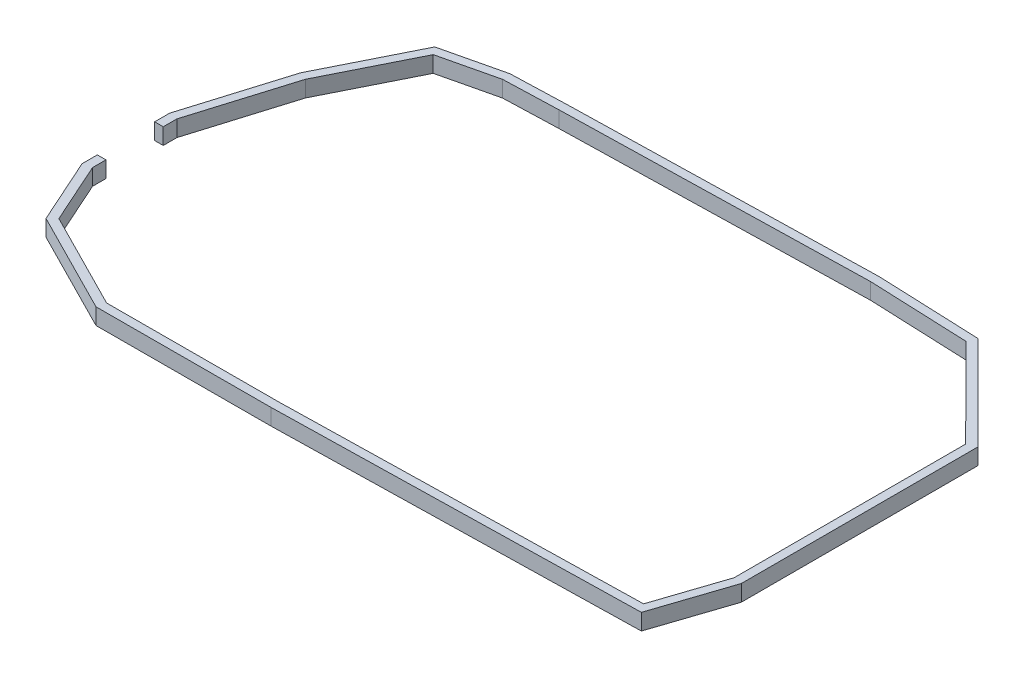
ISO-10303-21;
HEADER;
FILE_DESCRIPTION(('STEP AP214'),'2;1');
FILE_NAME('part.step','',(''),(''),'','','');
FILE_SCHEMA(('AUTOMOTIVE_DESIGN { 1 0 10303 214 1 1 1 1 }'));
ENDSEC;
DATA;
#1=APPLICATION_CONTEXT('core data for automotive mechanical design processes');
#2=APPLICATION_PROTOCOL_DEFINITION('international standard','automotive_design',2000,#1);
#3=PRODUCT_CONTEXT('',#1,'mechanical');
#4=PRODUCT('Part','Part','',(#3));
#5=PRODUCT_RELATED_PRODUCT_CATEGORY('part','',(#4));
#6=PRODUCT_DEFINITION_FORMATION('','',#4);
#7=PRODUCT_DEFINITION_CONTEXT('part definition',#1,'design');
#8=PRODUCT_DEFINITION('design','',#6,#7);
#9=PRODUCT_DEFINITION_SHAPE('','',#8);
#10=(LENGTH_UNIT() NAMED_UNIT(*) SI_UNIT(.MILLI.,.METRE.));
#11=(NAMED_UNIT(*) PLANE_ANGLE_UNIT() SI_UNIT($,.RADIAN.));
#12=(NAMED_UNIT(*) SI_UNIT($,.STERADIAN.) SOLID_ANGLE_UNIT());
#13=UNCERTAINTY_MEASURE_WITH_UNIT(LENGTH_MEASURE(1.E-05),#10,'distance_accuracy_value','');
#14=(GEOMETRIC_REPRESENTATION_CONTEXT(3) GLOBAL_UNCERTAINTY_ASSIGNED_CONTEXT((#13)) GLOBAL_UNIT_ASSIGNED_CONTEXT((#10,
#11,#12)) REPRESENTATION_CONTEXT('',''));
#15=CARTESIAN_POINT('',(0.,0.,0.));
#16=DIRECTION('',(0.,0.,1.));
#17=DIRECTION('',(1.,0.,0.));
#18=AXIS2_PLACEMENT_3D('',#15,#16,#17);
#19=CARTESIAN_POINT('',(-134.7633504157,99.55,-59.06712994019));
#20=DIRECTION('',(-0.894687808447042,0.,-0.446691980470021));
#21=DIRECTION('',(-0.446691980470021,0.,0.894687808447042));
#22=AXIS2_PLACEMENT_3D('',#19,#20,#21);
#23=PLANE('',#22);
#24=DIRECTION('',(0.,-1.,0.));
#25=VECTOR('',#24,1.);
#26=CARTESIAN_POINT('',(-134.7633504157,99.55,-59.06712994019));
#27=LINE('',#26,#25);
#28=CARTESIAN_POINT('',(-134.7633504157,99.55,-59.06712994019));
#29=VERTEX_POINT('',#28);
#30=CARTESIAN_POINT('',(-134.7633504157,94.45,-59.06712994019));
#31=VERTEX_POINT('',#30);
#32=EDGE_CURVE('E42',#29,#31,#27,.T.);
#33=ORIENTED_EDGE('',*,*,#32,.T.);
#34=DIRECTION('',(-0.446691980470021,0.,0.894687808447042));
#35=VECTOR('',#34,1.);
#36=CARTESIAN_POINT('',(-134.7633504157,94.45,-59.06712994019));
#37=LINE('',#36,#35);
#38=CARTESIAN_POINT('',(-148.8035804956,94.45,-30.94568780668));
#39=VERTEX_POINT('',#38);
#40=EDGE_CURVE('E343',#31,#39,#37,.T.);
#41=ORIENTED_EDGE('',*,*,#40,.T.);
#42=DIRECTION('',(0.,-1.,0.));
#43=VECTOR('',#42,1.);
#44=CARTESIAN_POINT('',(-148.8035804956,99.55,-30.94568780668));
#45=LINE('',#44,#43);
#46=CARTESIAN_POINT('',(-148.8035804956,99.55,-30.94568780668));
#47=VERTEX_POINT('',#46);
#48=EDGE_CURVE('E11',#47,#39,#45,.T.);
#49=ORIENTED_EDGE('',*,*,#48,.F.);
#50=DIRECTION('',(-0.446691980470021,0.,0.894687808447042));
#51=VECTOR('',#50,1.);
#52=CARTESIAN_POINT('',(-134.7633504157,99.55,-59.06712994019));
#53=LINE('',#52,#51);
#54=EDGE_CURVE('E468',#29,#47,#53,.T.);
#55=ORIENTED_EDGE('',*,*,#54,.F.);
#56=EDGE_LOOP('',(#33,#41,#49,#55));
#57=FACE_BOUND('',#56,.T.);
#58=ADVANCED_FACE('F17',(#57),#23,.T.);
#59=CARTESIAN_POINT('',(-148.8035804956,99.55,-30.94568780668));
#60=DIRECTION('',(-0.956779500675141,0.,-0.290814351585043));
#61=DIRECTION('',(-0.290814351585043,0.,0.956779500675141));
#62=AXIS2_PLACEMENT_3D('',#59,#60,#61);
#63=PLANE('',#62);
#64=ORIENTED_EDGE('',*,*,#48,.T.);
#65=DIRECTION('',(-0.290814351585043,0.,0.956779500675141));
#66=VECTOR('',#65,1.);
#67=CARTESIAN_POINT('',(-148.8035804956,94.45,-30.94568780668));
#68=LINE('',#67,#66);
#69=CARTESIAN_POINT('',(-158.4,94.45,0.626541732782));
#70=VERTEX_POINT('',#69);
#71=EDGE_CURVE('E339',#39,#70,#68,.T.);
#72=ORIENTED_EDGE('',*,*,#71,.T.);
#73=DIRECTION('',(0.,-1.,0.));
#74=VECTOR('',#73,1.);
#75=CARTESIAN_POINT('',(-158.4,99.55,0.626541732782));
#76=LINE('',#75,#74);
#77=CARTESIAN_POINT('',(-158.4,99.55,0.626541732782));
#78=VERTEX_POINT('',#77);
#79=EDGE_CURVE('E28',#78,#70,#76,.T.);
#80=ORIENTED_EDGE('',*,*,#79,.F.);
#81=DIRECTION('',(-0.290814351585043,0.,0.956779500675141));
#82=VECTOR('',#81,1.);
#83=CARTESIAN_POINT('',(-148.8035804956,99.55,-30.94568780668));
#84=LINE('',#83,#82);
#85=EDGE_CURVE('E21',#47,#78,#84,.T.);
#86=ORIENTED_EDGE('',*,*,#85,.F.);
#87=EDGE_LOOP('',(#64,#72,#80,#86));
#88=FACE_BOUND('',#87,.T.);
#89=ADVANCED_FACE('F679',(#88),#63,.T.);
#90=CARTESIAN_POINT('',(-158.4,99.55,0.626541732782));
#91=DIRECTION('',(-1.,0.,0.));
#92=DIRECTION('',(0.,0.,1.));
#93=AXIS2_PLACEMENT_3D('',#90,#91,#92);
#94=PLANE('',#93);
#95=DIRECTION('',(0.,0.,1.));
#96=VECTOR('',#95,1.);
#97=CARTESIAN_POINT('',(-158.4,99.55,0.626541732782));
#98=LINE('',#97,#96);
#99=CARTESIAN_POINT('',(-158.4,99.55,5.318774023319));
#100=VERTEX_POINT('',#99);
#101=EDGE_CURVE('E301',#78,#100,#98,.T.);
#102=ORIENTED_EDGE('',*,*,#101,.F.);
#103=ORIENTED_EDGE('',*,*,#79,.T.);
#104=DIRECTION('',(0.,0.,1.));
#105=VECTOR('',#104,1.);
#106=CARTESIAN_POINT('',(-158.4,94.45,0.626541732782));
#107=LINE('',#106,#105);
#108=CARTESIAN_POINT('',(-158.4,94.45,5.318774023319));
#109=VERTEX_POINT('',#108);
#110=EDGE_CURVE('E344',#70,#109,#107,.T.);
#111=ORIENTED_EDGE('',*,*,#110,.T.);
#112=DIRECTION('',(0.,-1.,0.));
#113=VECTOR('',#112,1.);
#114=CARTESIAN_POINT('',(-158.4,100.05,5.318774023319));
#115=LINE('',#114,#113);
#116=EDGE_CURVE('E512',#100,#109,#115,.T.);
#117=ORIENTED_EDGE('',*,*,#116,.F.);
#118=EDGE_LOOP('',(#102,#103,#111,#117));
#119=FACE_BOUND('',#118,.T.);
#120=ADVANCED_FACE('F611',(#119),#94,.T.);
#121=CARTESIAN_POINT('',(-150.7,100.55,5.318774023319));
#122=DIRECTION('',(0.,0.,-1.));
#123=DIRECTION('',(0.,-1.,0.));
#124=AXIS2_PLACEMENT_3D('',#121,#122,#123);
#125=PLANE('',#124);
#126=ORIENTED_EDGE('',*,*,#116,.T.);
#127=DIRECTION('',(-1.,0.,0.));
#128=VECTOR('',#127,1.);
#129=CARTESIAN_POINT('',(-98.3064200188,94.45,5.318774023319));
#130=LINE('',#129,#128);
#131=CARTESIAN_POINT('',(-155.7,94.45,5.318774023319));
#132=VERTEX_POINT('',#131);
#133=EDGE_CURVE('E429',#132,#109,#130,.T.);
#134=ORIENTED_EDGE('',*,*,#133,.F.);
#135=DIRECTION('',(0.,-1.,0.));
#136=VECTOR('',#135,1.);
#137=CARTESIAN_POINT('',(-155.7,100.55,5.318774023319));
#138=LINE('',#137,#136);
#139=CARTESIAN_POINT('',(-155.7,99.55,5.318774023319));
#140=VERTEX_POINT('',#139);
#141=EDGE_CURVE('E510',#140,#132,#138,.T.);
#142=ORIENTED_EDGE('',*,*,#141,.F.);
#143=DIRECTION('',(-1.,0.,0.));
#144=VECTOR('',#143,1.);
#145=CARTESIAN_POINT('',(-98.3064200188,99.55,5.318774023319));
#146=LINE('',#145,#144);
#147=EDGE_CURVE('E297',#140,#100,#146,.T.);
#148=ORIENTED_EDGE('',*,*,#147,.T.);
#149=EDGE_LOOP('',(#126,#134,#142,#148));
#150=FACE_BOUND('',#149,.T.);
#151=ADVANCED_FACE('F603',(#150),#125,.F.);
#152=CARTESIAN_POINT('',(-155.7,100.55,1.027812672614));
#153=DIRECTION('',(-1.,0.,0.));
#154=DIRECTION('',(0.,0.,1.));
#155=AXIS2_PLACEMENT_3D('',#152,#153,#154);
#156=PLANE('',#155);
#157=ORIENTED_EDGE('',*,*,#141,.T.);
#158=DIRECTION('',(0.,0.,1.));
#159=VECTOR('',#158,1.);
#160=CARTESIAN_POINT('',(-155.7,94.45,1.113861211773));
#161=LINE('',#160,#159);
#162=CARTESIAN_POINT('',(-155.7,94.45,1.027812672614));
#163=VERTEX_POINT('',#162);
#164=EDGE_CURVE('E279',#163,#132,#161,.T.);
#165=ORIENTED_EDGE('',*,*,#164,.F.);
#166=DIRECTION('',(0.,-1.,0.));
#167=VECTOR('',#166,1.);
#168=CARTESIAN_POINT('',(-155.7,100.55,1.027812672614));
#169=LINE('',#168,#167);
#170=CARTESIAN_POINT('',(-155.7,99.55,1.027812672614));
#171=VERTEX_POINT('',#170);
#172=EDGE_CURVE('E268',#171,#163,#169,.T.);
#173=ORIENTED_EDGE('',*,*,#172,.F.);
#174=DIRECTION('',(0.,0.,1.));
#175=VECTOR('',#174,1.);
#176=CARTESIAN_POINT('',(-155.7,99.55,1.113861211773));
#177=LINE('',#176,#175);
#178=EDGE_CURVE('E300',#171,#140,#177,.T.);
#179=ORIENTED_EDGE('',*,*,#178,.T.);
#180=EDGE_LOOP('',(#157,#165,#173,#179));
#181=FACE_BOUND('',#180,.T.);
#182=ADVANCED_FACE('F789',(#181),#156,.F.);
#183=CARTESIAN_POINT('',(-146.2863828275,100.55,-29.94299701645));
#184=DIRECTION('',(-0.956779500675141,0.,-0.290814351585043));
#185=DIRECTION('',(-0.290814351585043,0.,0.956779500675141));
#186=AXIS2_PLACEMENT_3D('',#183,#184,#185);
#187=PLANE('',#186);
#188=ORIENTED_EDGE('',*,*,#172,.T.);
#189=DIRECTION('',(-0.290814351585043,0.,0.956779500675141));
#190=VECTOR('',#189,1.);
#191=CARTESIAN_POINT('',(-146.3746199766,94.45,-29.65269670969));
#192=LINE('',#191,#190);
#193=CARTESIAN_POINT('',(-146.2863828275,94.45,-29.94299701645));
#194=VERTEX_POINT('',#193);
#195=EDGE_CURVE('E272',#194,#163,#192,.T.);
#196=ORIENTED_EDGE('',*,*,#195,.F.);
#197=DIRECTION('',(0.,-1.,0.));
#198=VECTOR('',#197,1.);
#199=CARTESIAN_POINT('',(-146.2863828275,100.55,-29.94299701645));
#200=LINE('',#199,#198);
#201=CARTESIAN_POINT('',(-146.2863828275,99.55,-29.94299701645));
#202=VERTEX_POINT('',#201);
#203=EDGE_CURVE('E256',#202,#194,#200,.T.);
#204=ORIENTED_EDGE('',*,*,#203,.F.);
#205=DIRECTION('',(-0.290814351585043,0.,0.956779500675141));
#206=VECTOR('',#205,1.);
#207=CARTESIAN_POINT('',(-146.3746199766,99.55,-29.65269670969));
#208=LINE('',#207,#206);
#209=EDGE_CURVE('E445',#202,#171,#208,.T.);
#210=ORIENTED_EDGE('',*,*,#209,.T.);
#211=EDGE_LOOP('',(#188,#196,#204,#210));
#212=FACE_BOUND('',#211,.T.);
#213=ADVANCED_FACE('F273',(#212),#187,.F.);
#214=CARTESIAN_POINT('',(-132.9124027547,100.55,-56.72999442121));
#215=DIRECTION('',(-0.894687808447042,0.,-0.446691980470021));
#216=DIRECTION('',(-0.446691980470021,0.,0.894687808447042));
#217=AXIS2_PLACEMENT_3D('',#214,#215,#216);
#218=PLANE('',#217);
#219=ORIENTED_EDGE('',*,*,#203,.T.);
#220=DIRECTION('',(-0.446691980470021,0.,0.894687808447042));
#221=VECTOR('',#220,1.);
#222=CARTESIAN_POINT('',(-135.8085686339,94.45,-50.92920905536));
#223=LINE('',#222,#221);
#224=CARTESIAN_POINT('',(-132.9124027547,94.45,-56.72999442121));
#225=VERTEX_POINT('',#224);
#226=EDGE_CURVE('E260',#225,#194,#223,.T.);
#227=ORIENTED_EDGE('',*,*,#226,.F.);
#228=DIRECTION('',(0.,-1.,0.));
#229=VECTOR('',#228,1.);
#230=CARTESIAN_POINT('',(-132.9124027547,100.55,-56.72999442121));
#231=LINE('',#230,#229);
#232=CARTESIAN_POINT('',(-132.9124027547,99.55,-56.72999442121));
#233=VERTEX_POINT('',#232);
#234=EDGE_CURVE('E269',#233,#225,#231,.T.);
#235=ORIENTED_EDGE('',*,*,#234,.F.);
#236=DIRECTION('',(-0.446691980470021,0.,0.894687808447042));
#237=VECTOR('',#236,1.);
#238=CARTESIAN_POINT('',(-135.8085686339,99.55,-50.92920905536));
#239=LINE('',#238,#237);
#240=EDGE_CURVE('E263',#233,#202,#239,.T.);
#241=ORIENTED_EDGE('',*,*,#240,.T.);
#242=EDGE_LOOP('',(#219,#227,#235,#241));
#243=FACE_BOUND('',#242,.T.);
#244=ADVANCED_FACE('F258',(#243),#218,.F.);
#245=CARTESIAN_POINT('',(-115.2720846066,100.55,-60.89614382919));
#246=DIRECTION('',(-0.229848822853935,0.,-0.973226345015722));
#247=DIRECTION('',(-0.973226345015722,0.,0.229848822853935));
#248=AXIS2_PLACEMENT_3D('',#245,#246,#247);
#249=PLANE('',#248);
#250=ORIENTED_EDGE('',*,*,#234,.T.);
#251=DIRECTION('',(-0.973226345015722,0.,0.229848822853935));
#252=VECTOR('',#251,1.);
#253=CARTESIAN_POINT('',(-89.36988963343,94.45,-67.01351729983));
#254=LINE('',#253,#252);
#255=CARTESIAN_POINT('',(-115.2720846066,94.45,-60.89614382919));
#256=VERTEX_POINT('',#255);
#257=EDGE_CURVE('E285',#256,#225,#254,.T.);
#258=ORIENTED_EDGE('',*,*,#257,.F.);
#259=DIRECTION('',(0.,-1.,0.));
#260=VECTOR('',#259,1.);
#261=CARTESIAN_POINT('',(-115.2720846066,100.55,-60.89614382919));
#262=LINE('',#261,#260);
#263=CARTESIAN_POINT('',(-115.2720846066,99.55,-60.89614382919));
#264=VERTEX_POINT('',#263);
#265=EDGE_CURVE('E438',#264,#256,#262,.T.);
#266=ORIENTED_EDGE('',*,*,#265,.F.);
#267=DIRECTION('',(-0.973226345015722,0.,0.229848822853935));
#268=VECTOR('',#267,1.);
#269=CARTESIAN_POINT('',(-89.36988963343,99.55,-67.01351729983));
#270=LINE('',#269,#268);
#271=EDGE_CURVE('E521',#264,#233,#270,.T.);
#272=ORIENTED_EDGE('',*,*,#271,.T.);
#273=EDGE_LOOP('',(#250,#258,#266,#272));
#274=FACE_BOUND('',#273,.T.);
#275=ADVANCED_FACE('F803',(#274),#249,.F.);
#276=CARTESIAN_POINT('',(-98.07765247511,100.55,-61.46791609549));
#277=DIRECTION('',(-0.0332349678904674,0.,-0.999447565862922));
#278=DIRECTION('',(-0.999447565862922,0.,0.0332349678904674));
#279=AXIS2_PLACEMENT_3D('',#276,#277,#278);
#280=PLANE('',#279);
#281=ORIENTED_EDGE('',*,*,#265,.T.);
#282=DIRECTION('',(-0.999447565862922,0.,0.0332349678904674));
#283=VECTOR('',#282,1.);
#284=CARTESIAN_POINT('',(-73.06486221473,94.45,-62.29967486859));
#285=LINE('',#284,#283);
#286=CARTESIAN_POINT('',(-98.07765247511,94.45,-61.46791609549));
#287=VERTEX_POINT('',#286);
#288=EDGE_CURVE('E292',#287,#256,#285,.T.);
#289=ORIENTED_EDGE('',*,*,#288,.F.);
#290=DIRECTION('',(0.,-1.,0.));
#291=VECTOR('',#290,1.);
#292=CARTESIAN_POINT('',(-98.07765247511,100.55,-61.46791609549));
#293=LINE('',#292,#291);
#294=CARTESIAN_POINT('',(-98.07765247511,99.55,-61.46791609549));
#295=VERTEX_POINT('',#294);
#296=EDGE_CURVE('E441',#295,#287,#293,.T.);
#297=ORIENTED_EDGE('',*,*,#296,.F.);
#298=DIRECTION('',(-0.999447565862922,0.,0.0332349678904674));
#299=VECTOR('',#298,1.);
#300=CARTESIAN_POINT('',(-73.06486221473,99.55,-62.29967486859));
#301=LINE('',#300,#299);
#302=EDGE_CURVE('E657',#295,#264,#301,.T.);
#303=ORIENTED_EDGE('',*,*,#302,.T.);
#304=EDGE_LOOP('',(#281,#289,#297,#303));
#305=FACE_BOUND('',#304,.T.);
#306=ADVANCED_FACE('F559',(#305),#280,.F.);
#307=CARTESIAN_POINT('',(-2.414992470044,100.55,-63.68571524558));
#308=DIRECTION('',(-0.0231773126798001,0.,-0.999731370007435));
#309=DIRECTION('',(-0.999731370007435,0.,0.0231773126798001));
#310=AXIS2_PLACEMENT_3D('',#307,#308,#309);
#311=PLANE('',#310);
#312=ORIENTED_EDGE('',*,*,#296,.T.);
#313=DIRECTION('',(-0.999731370007435,0.,0.0231773126798001));
#314=VECTOR('',#313,1.);
#315=CARTESIAN_POINT('',(-24.9039682134,94.45,-63.16434116621));
#316=LINE('',#315,#314);
#317=CARTESIAN_POINT('',(-2.414992470044,94.45,-63.68571524558));
#318=VERTEX_POINT('',#317);
#319=EDGE_CURVE('E337',#318,#287,#316,.T.);
#320=ORIENTED_EDGE('',*,*,#319,.F.);
#321=DIRECTION('',(0.,-1.,0.));
#322=VECTOR('',#321,1.);
#323=CARTESIAN_POINT('',(-2.414992470044,100.55,-63.68571524558));
#324=LINE('',#323,#322);
#325=CARTESIAN_POINT('',(-2.414992470044,99.55,-63.68571524558));
#326=VERTEX_POINT('',#325);
#327=EDGE_CURVE('E362',#326,#318,#324,.T.);
#328=ORIENTED_EDGE('',*,*,#327,.F.);
#329=DIRECTION('',(-0.999731370007435,0.,0.0231773126798001));
#330=VECTOR('',#329,1.);
#331=CARTESIAN_POINT('',(-24.9039682134,99.55,-63.16434116621));
#332=LINE('',#331,#330);
#333=EDGE_CURVE('E497',#326,#295,#332,.T.);
#334=ORIENTED_EDGE('',*,*,#333,.T.);
#335=EDGE_LOOP('',(#312,#320,#328,#334));
#336=FACE_BOUND('',#335,.T.);
#337=ADVANCED_FACE('F554',(#336),#311,.F.);
#338=CARTESIAN_POINT('',(28.752450026534,100.55,-62.41141158028));
#339=DIRECTION('',(0.040851600465121,0.,-0.999165224945023));
#340=DIRECTION('',(0.,-1.,0.));
#341=AXIS2_PLACEMENT_3D('',#338,#339,#340);
#342=PLANE('',#341);
#343=ORIENTED_EDGE('',*,*,#327,.T.);
#344=DIRECTION('',(-0.999165224945023,0.,-0.040851600465121));
#345=VECTOR('',#344,1.);
#346=CARTESIAN_POINT('',(-7.219664790476,94.45,-63.88215778491));
#347=LINE('',#346,#345);
#348=CARTESIAN_POINT('',(28.752450026534,94.45,-62.41141158028));
#349=VERTEX_POINT('',#348);
#350=EDGE_CURVE('E333',#349,#318,#347,.T.);
#351=ORIENTED_EDGE('',*,*,#350,.F.);
#352=DIRECTION('',(0.,-1.,0.));
#353=VECTOR('',#352,1.);
#354=CARTESIAN_POINT('',(28.752450026534,100.55,-62.41141158028));
#355=LINE('',#354,#353);
#356=CARTESIAN_POINT('',(28.752450026534,99.55,-62.41141158028));
#357=VERTEX_POINT('',#356);
#358=EDGE_CURVE('E358',#357,#349,#355,.T.);
#359=ORIENTED_EDGE('',*,*,#358,.F.);
#360=DIRECTION('',(-0.999165224945023,0.,-0.040851600465121));
#361=VECTOR('',#360,1.);
#362=CARTESIAN_POINT('',(-7.219664790476,99.55,-63.88215778491));
#363=LINE('',#362,#361);
#364=EDGE_CURVE('E492',#357,#326,#363,.T.);
#365=ORIENTED_EDGE('',*,*,#364,.T.);
#366=EDGE_LOOP('',(#343,#351,#359,#365));
#367=FACE_BOUND('',#366,.T.);
#368=ADVANCED_FACE('F564',(#367),#342,.F.);
#369=CARTESIAN_POINT('',(56.7,100.55,-34.42563537653));
#370=DIRECTION('',(0.707589870352046,0.,-0.706623361753046));
#371=DIRECTION('',(0.,-1.,0.));
#372=AXIS2_PLACEMENT_3D('',#369,#370,#371);
#373=PLANE('',#372);
#374=ORIENTED_EDGE('',*,*,#358,.T.);
#375=DIRECTION('',(-0.706623361753046,0.,-0.707589870352046));
#376=VECTOR('',#375,1.);
#377=CARTESIAN_POINT('',(39.988232023484,94.45,-51.16026145301));
#378=LINE('',#377,#376);
#379=CARTESIAN_POINT('',(56.7,94.45,-34.42563537653));
#380=VERTEX_POINT('',#379);
#381=EDGE_CURVE('E338',#380,#349,#378,.T.);
#382=ORIENTED_EDGE('',*,*,#381,.F.);
#383=DIRECTION('',(0.,-1.,0.));
#384=VECTOR('',#383,1.);
#385=CARTESIAN_POINT('',(56.7,100.55,-34.42563537653));
#386=LINE('',#385,#384);
#387=CARTESIAN_POINT('',(56.7,99.55,-34.42563537653));
#388=VERTEX_POINT('',#387);
#389=EDGE_CURVE('E357',#388,#380,#386,.T.);
#390=ORIENTED_EDGE('',*,*,#389,.F.);
#391=DIRECTION('',(-0.706623361753046,0.,-0.707589870352046));
#392=VECTOR('',#391,1.);
#393=CARTESIAN_POINT('',(39.988232023484,99.55,-51.16026145301));
#394=LINE('',#393,#392);
#395=EDGE_CURVE('E496',#388,#357,#394,.T.);
#396=ORIENTED_EDGE('',*,*,#395,.T.);
#397=EDGE_LOOP('',(#374,#382,#390,#396));
#398=FACE_BOUND('',#397,.T.);
#399=ADVANCED_FACE('F763',(#398),#373,.F.);
#400=CARTESIAN_POINT('',(56.7,100.55,38.328540100266));
#401=DIRECTION('',(1.,0.,0.));
#402=DIRECTION('',(0.,0.,1.));
#403=AXIS2_PLACEMENT_3D('',#400,#401,#402);
#404=PLANE('',#403);
#405=ORIENTED_EDGE('',*,*,#389,.T.);
#406=DIRECTION('',(0.,0.,-1.));
#407=VECTOR('',#406,1.);
#408=CARTESIAN_POINT('',(56.7,94.45,19.764224925599));
#409=LINE('',#408,#407);
#410=CARTESIAN_POINT('',(56.7,94.45,38.328540100266));
#411=VERTEX_POINT('',#410);
#412=EDGE_CURVE('E374',#411,#380,#409,.T.);
#413=ORIENTED_EDGE('',*,*,#412,.F.);
#414=DIRECTION('',(0.,-1.,0.));
#415=VECTOR('',#414,1.);
#416=CARTESIAN_POINT('',(56.7,100.55,38.328540100266));
#417=LINE('',#416,#415);
#418=CARTESIAN_POINT('',(56.7,99.55,38.328540100266));
#419=VERTEX_POINT('',#418);
#420=EDGE_CURVE('E353',#419,#411,#417,.T.);
#421=ORIENTED_EDGE('',*,*,#420,.F.);
#422=DIRECTION('',(0.,0.,-1.));
#423=VECTOR('',#422,1.);
#424=CARTESIAN_POINT('',(56.7,99.55,19.764224925599));
#425=LINE('',#424,#423);
#426=EDGE_CURVE('E529',#419,#388,#425,.T.);
#427=ORIENTED_EDGE('',*,*,#426,.T.);
#428=EDGE_LOOP('',(#405,#413,#421,#427));
#429=FACE_BOUND('',#428,.T.);
#430=ADVANCED_FACE('F761',(#429),#404,.F.);
#431=CARTESIAN_POINT('',(49.585312245764,100.55,59.672603362974));
#432=DIRECTION('',(0.948683298050514,0.,0.316227766016838));
#433=DIRECTION('',(0.,-1.,0.));
#434=AXIS2_PLACEMENT_3D('',#431,#432,#433);
#435=PLANE('',#434);
#436=ORIENTED_EDGE('',*,*,#420,.T.);
#437=DIRECTION('',(0.316227766016838,0.,-0.948683298050514));
#438=VECTOR('',#437,1.);
#439=CARTESIAN_POINT('',(53.581308673402,94.45,47.684614080061));
#440=LINE('',#439,#438);
#441=CARTESIAN_POINT('',(49.585312245764,94.45,59.672603362974));
#442=VERTEX_POINT('',#441);
#443=EDGE_CURVE('E413',#442,#411,#440,.T.);
#444=ORIENTED_EDGE('',*,*,#443,.F.);
#445=DIRECTION('',(0.,-1.,0.));
#446=VECTOR('',#445,1.);
#447=CARTESIAN_POINT('',(49.585312245764,100.55,59.672603362974));
#448=LINE('',#447,#446);
#449=CARTESIAN_POINT('',(49.585312245764,99.55,59.672603362974));
#450=VERTEX_POINT('',#449);
#451=EDGE_CURVE('E350',#450,#442,#448,.T.);
#452=ORIENTED_EDGE('',*,*,#451,.F.);
#453=DIRECTION('',(0.316227766016838,0.,-0.948683298050514));
#454=VECTOR('',#453,1.);
#455=CARTESIAN_POINT('',(53.581308673402,99.55,47.684614080061));
#456=LINE('',#455,#454);
#457=EDGE_CURVE('E525',#450,#419,#456,.T.);
#458=ORIENTED_EDGE('',*,*,#457,.T.);
#459=EDGE_LOOP('',(#436,#444,#452,#458));
#460=FACE_BOUND('',#459,.T.);
#461=ADVANCED_FACE('F757',(#460),#435,.F.);
#462=CARTESIAN_POINT('',(-62.50053338752,100.55,62.04399353344));
#463=DIRECTION('',(0.0211521767128717,0.,0.999776267682079));
#464=DIRECTION('',(0.,-1.,0.));
#465=AXIS2_PLACEMENT_3D('',#462,#463,#464);
#466=PLANE('',#465);
#467=ORIENTED_EDGE('',*,*,#451,.T.);
#468=DIRECTION('',(0.999776267682079,0.,-0.0211521767128717));
#469=VECTOR('',#468,1.);
#470=CARTESIAN_POINT('',(-53.56704906449,94.45,61.854988607868));
#471=LINE('',#470,#469);
#472=CARTESIAN_POINT('',(-62.50053338752,94.45,62.04399353344));
#473=VERTEX_POINT('',#472);
#474=EDGE_CURVE('E417',#473,#442,#471,.T.);
#475=ORIENTED_EDGE('',*,*,#474,.F.);
#476=DIRECTION('',(0.,-1.,0.));
#477=VECTOR('',#476,1.);
#478=CARTESIAN_POINT('',(-62.50053338752,100.55,62.04399353344));
#479=LINE('',#478,#477);
#480=CARTESIAN_POINT('',(-62.50053338752,99.55,62.04399353344));
#481=VERTEX_POINT('',#480);
#482=EDGE_CURVE('E354',#481,#473,#479,.T.);
#483=ORIENTED_EDGE('',*,*,#482,.F.);
#484=DIRECTION('',(0.999776267682079,0.,-0.0211521767128717));
#485=VECTOR('',#484,1.);
#486=CARTESIAN_POINT('',(-53.56704906449,99.55,61.854988607868));
#487=LINE('',#486,#485);
#488=EDGE_CURVE('E378',#481,#450,#487,.T.);
#489=ORIENTED_EDGE('',*,*,#488,.T.);
#490=EDGE_LOOP('',(#467,#475,#483,#489));
#491=FACE_BOUND('',#490,.T.);
#492=ADVANCED_FACE('F753',(#491),#466,.F.);
#493=CARTESIAN_POINT('',(-116.6391179552,100.55,62.167528114371));
#494=DIRECTION('',(0.00228181546145134,0.,0.999997396655711));
#495=DIRECTION('',(0.,-1.,0.));
#496=AXIS2_PLACEMENT_3D('',#493,#494,#495);
#497=PLANE('',#496);
#498=ORIENTED_EDGE('',*,*,#482,.T.);
#499=DIRECTION('',(0.999997396655711,0.,-0.00228181546145134));
#500=VECTOR('',#499,1.);
#501=CARTESIAN_POINT('',(-81.206604875,94.45,62.086677447704));
#502=LINE('',#501,#500);
#503=CARTESIAN_POINT('',(-116.6391179552,94.45,62.167528114371));
#504=VERTEX_POINT('',#503);
#505=EDGE_CURVE('E306',#504,#473,#502,.T.);
#506=ORIENTED_EDGE('',*,*,#505,.F.);
#507=DIRECTION('',(0.,-1.,0.));
#508=VECTOR('',#507,1.);
#509=CARTESIAN_POINT('',(-116.6391179552,100.55,62.167528114371));
#510=LINE('',#509,#508);
#511=CARTESIAN_POINT('',(-116.6391179552,99.55,62.167528114371));
#512=VERTEX_POINT('',#511);
#513=EDGE_CURVE('E463',#512,#504,#510,.T.);
#514=ORIENTED_EDGE('',*,*,#513,.F.);
#515=DIRECTION('',(0.999997396655711,0.,-0.00228181546145134));
#516=VECTOR('',#515,1.);
#517=CARTESIAN_POINT('',(-81.206604875,99.55,62.086677447704));
#518=LINE('',#517,#516);
#519=EDGE_CURVE('E366',#512,#481,#518,.T.);
#520=ORIENTED_EDGE('',*,*,#519,.T.);
#521=EDGE_LOOP('',(#498,#506,#514,#520));
#522=FACE_BOUND('',#521,.T.);
#523=ADVANCED_FACE('F749',(#522),#497,.F.);
#524=CARTESIAN_POINT('',(-147.0945652347,100.55,46.710701523703));
#525=DIRECTION('',(-0.452572007459911,0.,0.891727860988825));
#526=DIRECTION('',(0.,1.,0.));
#527=AXIS2_PLACEMENT_3D('',#524,#525,#526);
#528=PLANE('',#527);
#529=ORIENTED_EDGE('',*,*,#513,.T.);
#530=DIRECTION('',(0.891727860988825,0.,0.452572007459911));
#531=VECTOR('',#530,1.);
#532=CARTESIAN_POINT('',(-116.0492144747,94.45,62.466917439348));
#533=LINE('',#532,#531);
#534=CARTESIAN_POINT('',(-147.0945652347,94.45,46.710701523703));
#535=VERTEX_POINT('',#534);
#536=EDGE_CURVE('E302',#535,#504,#533,.T.);
#537=ORIENTED_EDGE('',*,*,#536,.F.);
#538=DIRECTION('',(0.,-1.,0.));
#539=VECTOR('',#538,1.);
#540=CARTESIAN_POINT('',(-147.0945652347,100.55,46.710701523703));
#541=LINE('',#540,#539);
#542=CARTESIAN_POINT('',(-147.0945652347,99.55,46.710701523703));
#543=VERTEX_POINT('',#542);
#544=EDGE_CURVE('E433',#543,#535,#541,.T.);
#545=ORIENTED_EDGE('',*,*,#544,.F.);
#546=DIRECTION('',(0.891727860988825,0.,0.452572007459911));
#547=VECTOR('',#546,1.);
#548=CARTESIAN_POINT('',(-116.0492144747,99.55,62.466917439348));
#549=LINE('',#548,#547);
#550=EDGE_CURVE('E319',#543,#512,#549,.T.);
#551=ORIENTED_EDGE('',*,*,#550,.T.);
#552=EDGE_LOOP('',(#529,#537,#545,#551));
#553=FACE_BOUND('',#552,.T.);
#554=ADVANCED_FACE('F745',(#553),#528,.F.);
#555=CARTESIAN_POINT('',(-155.7,100.55,27.544162381199));
#556=DIRECTION('',(-0.912268647108363,0.,0.409592377252163));
#557=DIRECTION('',(0.,1.,0.));
#558=AXIS2_PLACEMENT_3D('',#555,#556,#557);
#559=PLANE('',#558);
#560=ORIENTED_EDGE('',*,*,#544,.T.);
#561=DIRECTION('',(0.409592377252163,0.,0.912268647108363));
#562=VECTOR('',#561,1.);
#563=CARTESIAN_POINT('',(-151.4126024129,94.45,37.093310787241));
#564=LINE('',#563,#562);
#565=CARTESIAN_POINT('',(-155.7,94.45,27.544162381199));
#566=VERTEX_POINT('',#565);
#567=EDGE_CURVE('E307',#566,#535,#564,.T.);
#568=ORIENTED_EDGE('',*,*,#567,.F.);
#569=DIRECTION('',(0.,-1.,0.));
#570=VECTOR('',#569,1.);
#571=CARTESIAN_POINT('',(-155.7,100.55,27.544162381199));
#572=LINE('',#571,#570);
#573=CARTESIAN_POINT('',(-155.7,99.55,27.544162381199));
#574=VERTEX_POINT('',#573);
#575=EDGE_CURVE('E430',#574,#566,#572,.T.);
#576=ORIENTED_EDGE('',*,*,#575,.F.);
#577=DIRECTION('',(0.409592377252163,0.,0.912268647108363));
#578=VECTOR('',#577,1.);
#579=CARTESIAN_POINT('',(-151.4126024129,99.55,37.093310787241));
#580=LINE('',#579,#578);
#581=EDGE_CURVE('E314',#574,#543,#580,.T.);
#582=ORIENTED_EDGE('',*,*,#581,.T.);
#583=EDGE_LOOP('',(#560,#568,#576,#582));
#584=FACE_BOUND('',#583,.T.);
#585=ADVANCED_FACE('F741',(#584),#559,.F.);
#586=CARTESIAN_POINT('',(-155.7,100.55,1.027812672614));
#587=DIRECTION('',(-1.,0.,0.));
#588=DIRECTION('',(0.,0.,1.));
#589=AXIS2_PLACEMENT_3D('',#586,#587,#588);
#590=PLANE('',#589);
#591=ORIENTED_EDGE('',*,*,#575,.T.);
#592=DIRECTION('',(0.,0.,1.));
#593=VECTOR('',#592,1.);
#594=CARTESIAN_POINT('',(-155.7,94.45,1.113861211773));
#595=LINE('',#594,#593);
#596=CARTESIAN_POINT('',(-155.7,94.45,23.318774023319));
#597=VERTEX_POINT('',#596);
#598=EDGE_CURVE('E320',#597,#566,#595,.T.);
#599=ORIENTED_EDGE('',*,*,#598,.F.);
#600=DIRECTION('',(0.,1.,0.));
#601=VECTOR('',#600,1.);
#602=CARTESIAN_POINT('',(-155.7,100.55,23.318774023319));
#603=LINE('',#602,#601);
#604=CARTESIAN_POINT('',(-155.7,99.55,23.318774023319));
#605=VERTEX_POINT('',#604);
#606=EDGE_CURVE('E382',#597,#605,#603,.T.);
#607=ORIENTED_EDGE('',*,*,#606,.T.);
#608=DIRECTION('',(0.,0.,1.));
#609=VECTOR('',#608,1.);
#610=CARTESIAN_POINT('',(-155.7,99.55,1.113861211773));
#611=LINE('',#610,#609);
#612=EDGE_CURVE('E318',#605,#574,#611,.T.);
#613=ORIENTED_EDGE('',*,*,#612,.T.);
#614=EDGE_LOOP('',(#591,#599,#607,#613));
#615=FACE_BOUND('',#614,.T.);
#616=ADVANCED_FACE('F737',(#615),#590,.F.);
#617=CARTESIAN_POINT('',(-162.7,100.55,23.318774023319));
#618=DIRECTION('',(0.,0.,1.));
#619=DIRECTION('',(1.,0.,0.));
#620=AXIS2_PLACEMENT_3D('',#617,#618,#619);
#621=PLANE('',#620);
#622=ORIENTED_EDGE('',*,*,#606,.F.);
#623=DIRECTION('',(1.,0.,0.));
#624=VECTOR('',#623,1.);
#625=CARTESIAN_POINT('',(-104.3064200188,94.45,23.318774023319));
#626=LINE('',#625,#624);
#627=CARTESIAN_POINT('',(-158.4,94.45,23.318774023319));
#628=VERTEX_POINT('',#627);
#629=EDGE_CURVE('E324',#628,#597,#626,.T.);
#630=ORIENTED_EDGE('',*,*,#629,.F.);
#631=DIRECTION('',(0.,1.,0.));
#632=VECTOR('',#631,1.);
#633=CARTESIAN_POINT('',(-158.4,100.05,23.318774023319));
#634=LINE('',#633,#632);
#635=CARTESIAN_POINT('',(-158.4,99.55,23.318774023319));
#636=VERTEX_POINT('',#635);
#637=EDGE_CURVE('E379',#628,#636,#634,.T.);
#638=ORIENTED_EDGE('',*,*,#637,.T.);
#639=DIRECTION('',(1.,0.,0.));
#640=VECTOR('',#639,1.);
#641=CARTESIAN_POINT('',(-104.3064200188,99.55,23.318774023319));
#642=LINE('',#641,#640);
#643=EDGE_CURVE('E370',#636,#605,#642,.T.);
#644=ORIENTED_EDGE('',*,*,#643,.T.);
#645=EDGE_LOOP('',(#622,#630,#638,#644));
#646=FACE_BOUND('',#645,.T.);
#647=ADVANCED_FACE('F733',(#646),#621,.F.);
#648=CARTESIAN_POINT('',(-158.4,99.55,0.626541732782));
#649=DIRECTION('',(-1.,0.,0.));
#650=DIRECTION('',(0.,0.,1.));
#651=AXIS2_PLACEMENT_3D('',#648,#649,#650);
#652=PLANE('',#651);
#653=DIRECTION('',(0.,0.,1.));
#654=VECTOR('',#653,1.);
#655=CARTESIAN_POINT('',(-158.4,99.55,0.626541732782));
#656=LINE('',#655,#654);
#657=CARTESIAN_POINT('',(-158.4,99.55,28.122480401658));
#658=VERTEX_POINT('',#657);
#659=EDGE_CURVE('E643',#636,#658,#656,.T.);
#660=ORIENTED_EDGE('',*,*,#659,.F.);
#661=ORIENTED_EDGE('',*,*,#637,.F.);
#662=DIRECTION('',(0.,0.,1.));
#663=VECTOR('',#662,1.);
#664=CARTESIAN_POINT('',(-158.4,94.45,0.626541732782));
#665=LINE('',#664,#663);
#666=CARTESIAN_POINT('',(-158.4,94.45,28.122480401658));
#667=VERTEX_POINT('',#666);
#668=EDGE_CURVE('E328',#628,#667,#665,.T.);
#669=ORIENTED_EDGE('',*,*,#668,.T.);
#670=DIRECTION('',(0.,-1.,0.));
#671=VECTOR('',#670,1.);
#672=CARTESIAN_POINT('',(-158.4,99.55,28.122480401658));
#673=LINE('',#672,#671);
#674=EDGE_CURVE('E383',#658,#667,#673,.T.);
#675=ORIENTED_EDGE('',*,*,#674,.F.);
#676=EDGE_LOOP('',(#660,#661,#669,#675));
#677=FACE_BOUND('',#676,.T.);
#678=ADVANCED_FACE('F730',(#677),#652,.T.);
#679=CARTESIAN_POINT('',(-158.4,99.55,28.122480401658));
#680=DIRECTION('',(-0.912268647108363,0.,0.409592377252163));
#681=DIRECTION('',(0.,1.,0.));
#682=AXIS2_PLACEMENT_3D('',#679,#680,#681);
#683=PLANE('',#682);
#684=ORIENTED_EDGE('',*,*,#674,.T.);
#685=DIRECTION('',(0.409592377252163,0.,0.912268647108363));
#686=VECTOR('',#685,1.);
#687=CARTESIAN_POINT('',(-158.4,94.45,28.122480401658));
#688=LINE('',#687,#686);
#689=CARTESIAN_POINT('',(-149.1670271375,94.45,48.686709937644));
#690=VERTEX_POINT('',#689);
#691=EDGE_CURVE('E390',#667,#690,#688,.T.);
#692=ORIENTED_EDGE('',*,*,#691,.T.);
#693=DIRECTION('',(0.,-1.,0.));
#694=VECTOR('',#693,1.);
#695=CARTESIAN_POINT('',(-149.1670271375,99.55,48.686709937644));
#696=LINE('',#695,#694);
#697=CARTESIAN_POINT('',(-149.1670271375,99.55,48.686709937644));
#698=VERTEX_POINT('',#697);
#699=EDGE_CURVE('E434',#698,#690,#696,.T.);
#700=ORIENTED_EDGE('',*,*,#699,.F.);
#701=DIRECTION('',(0.409592377252163,0.,0.912268647108363));
#702=VECTOR('',#701,1.);
#703=CARTESIAN_POINT('',(-158.4,99.55,28.122480401658));
#704=LINE('',#703,#702);
#705=EDGE_CURVE('E425',#658,#698,#704,.T.);
#706=ORIENTED_EDGE('',*,*,#705,.F.);
#707=EDGE_LOOP('',(#684,#692,#700,#706));
#708=FACE_BOUND('',#707,.T.);
#709=ADVANCED_FACE('F19',(#708),#683,.T.);
#710=CARTESIAN_POINT('',(-149.1670271375,99.55,48.686709937644));
#711=DIRECTION('',(-0.452572007459911,0.,0.891727860988825));
#712=DIRECTION('',(0.,1.,0.));
#713=AXIS2_PLACEMENT_3D('',#710,#711,#712);
#714=PLANE('',#713);
#715=ORIENTED_EDGE('',*,*,#699,.T.);
#716=DIRECTION('',(0.891727860988825,0.,0.452572007459911));
#717=VECTOR('',#716,1.);
#718=CARTESIAN_POINT('',(-149.1670271375,94.45,48.686709937644));
#719=LINE('',#718,#717);
#720=CARTESIAN_POINT('',(-117.282153928,94.45,64.869002436664));
#721=VERTEX_POINT('',#720);
#722=EDGE_CURVE('E394',#690,#721,#719,.T.);
#723=ORIENTED_EDGE('',*,*,#722,.T.);
#724=DIRECTION('',(0.,-1.,0.));
#725=VECTOR('',#724,1.);
#726=CARTESIAN_POINT('',(-117.282153928,99.55,64.869002436664));
#727=LINE('',#726,#725);
#728=CARTESIAN_POINT('',(-117.282153928,99.55,64.869002436664));
#729=VERTEX_POINT('',#728);
#730=EDGE_CURVE('E437',#729,#721,#727,.T.);
#731=ORIENTED_EDGE('',*,*,#730,.F.);
#732=DIRECTION('',(0.891727860988825,0.,0.452572007459911));
#733=VECTOR('',#732,1.);
#734=CARTESIAN_POINT('',(-149.1670271375,99.55,48.686709937644));
#735=LINE('',#734,#733);
#736=EDGE_CURVE('E420',#698,#729,#735,.T.);
#737=ORIENTED_EDGE('',*,*,#736,.F.);
#738=EDGE_LOOP('',(#715,#723,#731,#737));
#739=FACE_BOUND('',#738,.T.);
#740=ADVANCED_FACE('F723',(#739),#714,.T.);
#741=CARTESIAN_POINT('',(-117.282153928,99.55,64.869002436664));
#742=DIRECTION('',(0.00228181546145134,0.,0.999997396655711));
#743=DIRECTION('',(0.,-1.,0.));
#744=AXIS2_PLACEMENT_3D('',#741,#742,#743);
#745=PLANE('',#744);
#746=ORIENTED_EDGE('',*,*,#730,.T.);
#747=DIRECTION('',(0.999997396655711,0.,-0.00228181546145134));
#748=VECTOR('',#747,1.);
#749=CARTESIAN_POINT('',(-117.282153928,94.45,64.869002436664));
#750=LINE('',#749,#748);
#751=CARTESIAN_POINT('',(-62.46889468114,94.45,64.743928368611));
#752=VERTEX_POINT('',#751);
#753=EDGE_CURVE('E451',#721,#752,#750,.T.);
#754=ORIENTED_EDGE('',*,*,#753,.T.);
#755=DIRECTION('',(0.,-1.,0.));
#756=VECTOR('',#755,1.);
#757=CARTESIAN_POINT('',(-62.46889468114,99.55,64.743928368611));
#758=LINE('',#757,#756);
#759=CARTESIAN_POINT('',(-62.46889468114,99.55,64.743928368611));
#760=VERTEX_POINT('',#759);
#761=EDGE_CURVE('E488',#760,#752,#758,.T.);
#762=ORIENTED_EDGE('',*,*,#761,.F.);
#763=DIRECTION('',(0.999997396655711,0.,-0.00228181546145134));
#764=VECTOR('',#763,1.);
#765=CARTESIAN_POINT('',(-117.282153928,99.55,64.869002436664));
#766=LINE('',#765,#764);
#767=EDGE_CURVE('E424',#729,#760,#766,.T.);
#768=ORIENTED_EDGE('',*,*,#767,.F.);
#769=EDGE_LOOP('',(#746,#754,#762,#768));
#770=FACE_BOUND('',#769,.T.);
#771=ADVANCED_FACE('F719',(#770),#745,.T.);
#772=CARTESIAN_POINT('',(-62.46889468114,99.55,64.743928368611));
#773=DIRECTION('',(0.0211521767128717,0.,0.999776267682079));
#774=DIRECTION('',(0.,-1.,0.));
#775=AXIS2_PLACEMENT_3D('',#772,#773,#774);
#776=PLANE('',#775);
#777=ORIENTED_EDGE('',*,*,#761,.T.);
#778=DIRECTION('',(0.999776267682079,0.,-0.0211521767128717));
#779=VECTOR('',#778,1.);
#780=CARTESIAN_POINT('',(-62.46889468114,94.45,64.743928368611));
#781=LINE('',#780,#779);
#782=CARTESIAN_POINT('',(51.544980913777,94.45,62.331747041388));
#783=VERTEX_POINT('',#782);
#784=EDGE_CURVE('E312',#752,#783,#781,.T.);
#785=ORIENTED_EDGE('',*,*,#784,.T.);
#786=DIRECTION('',(0.,-1.,0.));
#787=VECTOR('',#786,1.);
#788=CARTESIAN_POINT('',(51.544980913777,99.55,62.331747041388));
#789=LINE('',#788,#787);
#790=CARTESIAN_POINT('',(51.544980913777,99.55,62.331747041388));
#791=VERTEX_POINT('',#790);
#792=EDGE_CURVE('E516',#791,#783,#789,.T.);
#793=ORIENTED_EDGE('',*,*,#792,.F.);
#794=DIRECTION('',(0.999776267682079,0.,-0.0211521767128717));
#795=VECTOR('',#794,1.);
#796=CARTESIAN_POINT('',(-62.46889468114,99.55,64.743928368611));
#797=LINE('',#796,#795);
#798=EDGE_CURVE('E389',#760,#791,#797,.T.);
#799=ORIENTED_EDGE('',*,*,#798,.F.);
#800=EDGE_LOOP('',(#777,#785,#793,#799));
#801=FACE_BOUND('',#800,.T.);
#802=ADVANCED_FACE('F714',(#801),#776,.T.);
#803=CARTESIAN_POINT('',(51.544980913777,99.55,62.331747041388));
#804=DIRECTION('',(0.948683298050514,0.,0.316227766016838));
#805=DIRECTION('',(0.,-1.,0.));
#806=AXIS2_PLACEMENT_3D('',#803,#804,#805);
#807=PLANE('',#806);
#808=ORIENTED_EDGE('',*,*,#792,.T.);
#809=DIRECTION('',(0.316227766016838,0.,-0.948683298050514));
#810=VECTOR('',#809,1.);
#811=CARTESIAN_POINT('',(51.544980913777,94.45,62.331747041388));
#812=LINE('',#811,#810);
#813=CARTESIAN_POINT('',(59.4,94.45,38.76668978272));
#814=VERTEX_POINT('',#813);
#815=EDGE_CURVE('E308',#783,#814,#812,.T.);
#816=ORIENTED_EDGE('',*,*,#815,.T.);
#817=DIRECTION('',(0.,-1.,0.));
#818=VECTOR('',#817,1.);
#819=CARTESIAN_POINT('',(59.4,99.55,38.76668978272));
#820=LINE('',#819,#818);
#821=CARTESIAN_POINT('',(59.4,99.55,38.76668978272));
#822=VERTEX_POINT('',#821);
#823=EDGE_CURVE('E460',#822,#814,#820,.T.);
#824=ORIENTED_EDGE('',*,*,#823,.F.);
#825=DIRECTION('',(0.316227766016838,0.,-0.948683298050514));
#826=VECTOR('',#825,1.);
#827=CARTESIAN_POINT('',(51.544980913777,99.55,62.331747041388));
#828=LINE('',#827,#826);
#829=EDGE_CURVE('E384',#791,#822,#828,.T.);
#830=ORIENTED_EDGE('',*,*,#829,.F.);
#831=EDGE_LOOP('',(#808,#816,#824,#830));
#832=FACE_BOUND('',#831,.T.);
#833=ADVANCED_FACE('F711',(#832),#807,.T.);
#834=CARTESIAN_POINT('',(59.4,99.55,38.76668978272));
#835=DIRECTION('',(1.,0.,0.));
#836=DIRECTION('',(0.,0.,1.));
#837=AXIS2_PLACEMENT_3D('',#834,#835,#836);
#838=PLANE('',#837);
#839=ORIENTED_EDGE('',*,*,#823,.T.);
#840=DIRECTION('',(0.,0.,-1.));
#841=VECTOR('',#840,1.);
#842=CARTESIAN_POINT('',(59.4,94.45,38.76668978272));
#843=LINE('',#842,#841);
#844=CARTESIAN_POINT('',(59.4,94.45,-35.54293122717));
#845=VERTEX_POINT('',#844);
#846=EDGE_CURVE('E313',#814,#845,#843,.T.);
#847=ORIENTED_EDGE('',*,*,#846,.T.);
#848=DIRECTION('',(0.,-1.,0.));
#849=VECTOR('',#848,1.);
#850=CARTESIAN_POINT('',(59.4,99.55,-35.54293122717));
#851=LINE('',#850,#849);
#852=CARTESIAN_POINT('',(59.4,99.55,-35.54293122717));
#853=VERTEX_POINT('',#852);
#854=EDGE_CURVE('E329',#853,#845,#851,.T.);
#855=ORIENTED_EDGE('',*,*,#854,.F.);
#856=DIRECTION('',(0.,0.,-1.));
#857=VECTOR('',#856,1.);
#858=CARTESIAN_POINT('',(59.4,99.55,38.76668978272));
#859=LINE('',#858,#857);
#860=EDGE_CURVE('E388',#822,#853,#859,.T.);
#861=ORIENTED_EDGE('',*,*,#860,.F.);
#862=EDGE_LOOP('',(#839,#847,#855,#861));
#863=FACE_BOUND('',#862,.T.);
#864=ADVANCED_FACE('F707',(#863),#838,.T.);
#865=CARTESIAN_POINT('',(-115.6307758615,99.55,-63.58570854421));
#866=DIRECTION('',(-0.229848822853935,0.,-0.973226345015722));
#867=DIRECTION('',(-0.973226345015722,0.,0.229848822853935));
#868=AXIS2_PLACEMENT_3D('',#865,#866,#867);
#869=PLANE('',#868);
#870=DIRECTION('',(0.,-1.,0.));
#871=VECTOR('',#870,1.);
#872=CARTESIAN_POINT('',(-115.6307758615,99.55,-63.58570854421));
#873=LINE('',#872,#871);
#874=CARTESIAN_POINT('',(-115.6307758615,99.55,-63.58570854421));
#875=VERTEX_POINT('',#874);
#876=CARTESIAN_POINT('',(-115.6307758615,94.45,-63.58570854421));
#877=VERTEX_POINT('',#876);
#878=EDGE_CURVE('E406',#875,#877,#873,.T.);
#879=ORIENTED_EDGE('',*,*,#878,.T.);
#880=DIRECTION('',(-0.973226345015722,0.,0.229848822853935));
#881=VECTOR('',#880,1.);
#882=CARTESIAN_POINT('',(-115.6307758615,94.45,-63.58570854421));
#883=LINE('',#882,#881);
#884=EDGE_CURVE('E332',#877,#31,#883,.T.);
#885=ORIENTED_EDGE('',*,*,#884,.T.);
#886=ORIENTED_EDGE('',*,*,#32,.F.);
#887=DIRECTION('',(-0.973226345015722,0.,0.229848822853935));
#888=VECTOR('',#887,1.);
#889=CARTESIAN_POINT('',(-115.6307758615,99.55,-63.58570854421));
#890=LINE('',#889,#888);
#891=EDGE_CURVE('E464',#875,#29,#890,.T.);
#892=ORIENTED_EDGE('',*,*,#891,.F.);
#893=EDGE_LOOP('',(#879,#885,#886,#892));
#894=FACE_BOUND('',#893,.T.);
#895=ADVANCED_FACE('F686',(#894),#869,.T.);
#896=CARTESIAN_POINT('',(59.4,99.55,-35.54293122717));
#897=DIRECTION('',(0.707589870352046,0.,-0.706623361753046));
#898=DIRECTION('',(0.,-1.,0.));
#899=AXIS2_PLACEMENT_3D('',#896,#897,#898);
#900=PLANE('',#899);
#901=ORIENTED_EDGE('',*,*,#854,.T.);
#902=DIRECTION('',(-0.706623361753046,0.,-0.707589870352046));
#903=VECTOR('',#902,1.);
#904=CARTESIAN_POINT('',(59.4,94.45,-35.54293122717));
#905=LINE('',#904,#903);
#906=CARTESIAN_POINT('',(29.917212126023,94.45,-65.06604520628));
#907=VERTEX_POINT('',#906);
#908=EDGE_CURVE('E501',#845,#907,#905,.T.);
#909=ORIENTED_EDGE('',*,*,#908,.T.);
#910=DIRECTION('',(0.,-1.,0.));
#911=VECTOR('',#910,1.);
#912=CARTESIAN_POINT('',(29.917212126023,99.55,-65.06604520628));
#913=LINE('',#912,#911);
#914=CARTESIAN_POINT('',(29.917212126023,99.55,-65.06604520628));
#915=VERTEX_POINT('',#914);
#916=EDGE_CURVE('E412',#915,#907,#913,.T.);
#917=ORIENTED_EDGE('',*,*,#916,.F.);
#918=DIRECTION('',(-0.706623361753046,0.,-0.707589870352046));
#919=VECTOR('',#918,1.);
#920=CARTESIAN_POINT('',(59.4,99.55,-35.54293122717));
#921=LINE('',#920,#919);
#922=EDGE_CURVE('E507',#853,#915,#921,.T.);
#923=ORIENTED_EDGE('',*,*,#922,.F.);
#924=EDGE_LOOP('',(#901,#909,#917,#923));
#925=FACE_BOUND('',#924,.T.);
#926=ADVANCED_FACE('F702',(#925),#900,.T.);
#927=CARTESIAN_POINT('',(-45.91284003761,94.45,1.199909750932));
#928=DIRECTION('',(0.,1.,0.));
#929=DIRECTION('',(1.,0.,0.));
#930=AXIS2_PLACEMENT_3D('',#927,#928,#929);
#931=PLANE('',#930);
#932=ORIENTED_EDGE('',*,*,#908,.F.);
#933=ORIENTED_EDGE('',*,*,#846,.F.);
#934=ORIENTED_EDGE('',*,*,#815,.F.);
#935=ORIENTED_EDGE('',*,*,#784,.F.);
#936=ORIENTED_EDGE('',*,*,#753,.F.);
#937=ORIENTED_EDGE('',*,*,#722,.F.);
#938=ORIENTED_EDGE('',*,*,#691,.F.);
#939=ORIENTED_EDGE('',*,*,#668,.F.);
#940=ORIENTED_EDGE('',*,*,#629,.T.);
#941=ORIENTED_EDGE('',*,*,#598,.T.);
#942=ORIENTED_EDGE('',*,*,#567,.T.);
#943=ORIENTED_EDGE('',*,*,#536,.T.);
#944=ORIENTED_EDGE('',*,*,#505,.T.);
#945=ORIENTED_EDGE('',*,*,#474,.T.);
#946=ORIENTED_EDGE('',*,*,#443,.T.);
#947=ORIENTED_EDGE('',*,*,#412,.T.);
#948=ORIENTED_EDGE('',*,*,#381,.T.);
#949=ORIENTED_EDGE('',*,*,#350,.T.);
#950=ORIENTED_EDGE('',*,*,#319,.T.);
#951=ORIENTED_EDGE('',*,*,#288,.T.);
#952=ORIENTED_EDGE('',*,*,#257,.T.);
#953=ORIENTED_EDGE('',*,*,#226,.T.);
#954=ORIENTED_EDGE('',*,*,#195,.T.);
#955=ORIENTED_EDGE('',*,*,#164,.T.);
#956=ORIENTED_EDGE('',*,*,#133,.T.);
#957=ORIENTED_EDGE('',*,*,#110,.F.);
#958=ORIENTED_EDGE('',*,*,#71,.F.);
#959=ORIENTED_EDGE('',*,*,#40,.F.);
#960=ORIENTED_EDGE('',*,*,#884,.F.);
#961=DIRECTION('',(-0.999447565862922,0.,0.0332349678904674));
#962=VECTOR('',#961,1.);
#963=CARTESIAN_POINT('',(-98.1538109814,94.45,-64.16687596755));
#964=LINE('',#963,#962);
#965=CARTESIAN_POINT('',(-98.1538109814,94.45,-64.16687596755));
#966=VERTEX_POINT('',#965);
#967=EDGE_CURVE('E402',#966,#877,#964,.T.);
#968=ORIENTED_EDGE('',*,*,#967,.F.);
#969=DIRECTION('',(-0.999731370007435,0.,0.0231773126798001));
#970=VECTOR('',#969,1.);
#971=CARTESIAN_POINT('',(-2.391107699511,94.45,-66.38699447499));
#972=LINE('',#971,#970);
#973=CARTESIAN_POINT('',(-2.391107699511,94.45,-66.38699447499));
#974=VERTEX_POINT('',#973);
#975=EDGE_CURVE('E349',#974,#966,#972,.T.);
#976=ORIENTED_EDGE('',*,*,#975,.F.);
#977=DIRECTION('',(-0.999165224945023,0.,-0.040851600465121));
#978=VECTOR('',#977,1.);
#979=CARTESIAN_POINT('',(29.917212126023,94.45,-65.06604520628));
#980=LINE('',#979,#978);
#981=EDGE_CURVE('E472',#907,#974,#980,.T.);
#982=ORIENTED_EDGE('',*,*,#981,.F.);
#983=EDGE_LOOP('',(#932,#933,#934,#935,#936,#937,#938,#939,#940,#941,#942,#943,#944,#945,#946,
#947,#948,#949,#950,#951,#952,#953,#954,#955,#956,#957,#958,#959,#960,#968,#976,#982));
#984=FACE_BOUND('',#983,.T.);
#985=ADVANCED_FACE('F282',(#984),#931,.F.);
#986=CARTESIAN_POINT('',(-45.91284003761,99.55,1.199909750932));
#987=DIRECTION('',(0.,1.,0.));
#988=DIRECTION('',(1.,0.,0.));
#989=AXIS2_PLACEMENT_3D('',#986,#987,#988);
#990=PLANE('',#989);
#991=DIRECTION('',(-0.999165224945023,0.,-0.040851600465121));
#992=VECTOR('',#991,1.);
#993=CARTESIAN_POINT('',(29.917212126023,99.55,-65.06604520628));
#994=LINE('',#993,#992);
#995=CARTESIAN_POINT('',(-2.391107699511,99.55,-66.38699447499));
#996=VERTEX_POINT('',#995);
#997=EDGE_CURVE('E407',#915,#996,#994,.T.);
#998=ORIENTED_EDGE('',*,*,#997,.T.);
#999=DIRECTION('',(-0.999731370007435,0.,0.0231773126798001));
#1000=VECTOR('',#999,1.);
#1001=CARTESIAN_POINT('',(-2.391107699511,99.55,-66.38699447499));
#1002=LINE('',#1001,#1000);
#1003=CARTESIAN_POINT('',(-98.1538109814,99.55,-64.16687596755));
#1004=VERTEX_POINT('',#1003);
#1005=EDGE_CURVE('E408',#996,#1004,#1002,.T.);
#1006=ORIENTED_EDGE('',*,*,#1005,.T.);
#1007=DIRECTION('',(-0.999447565862922,0.,0.0332349678904674));
#1008=VECTOR('',#1007,1.);
#1009=CARTESIAN_POINT('',(-98.1538109814,99.55,-64.16687596755));
#1010=LINE('',#1009,#1008);
#1011=EDGE_CURVE('E469',#1004,#875,#1010,.T.);
#1012=ORIENTED_EDGE('',*,*,#1011,.T.);
#1013=ORIENTED_EDGE('',*,*,#891,.T.);
#1014=ORIENTED_EDGE('',*,*,#54,.T.);
#1015=ORIENTED_EDGE('',*,*,#85,.T.);
#1016=ORIENTED_EDGE('',*,*,#101,.T.);
#1017=ORIENTED_EDGE('',*,*,#147,.F.);
#1018=ORIENTED_EDGE('',*,*,#178,.F.);
#1019=ORIENTED_EDGE('',*,*,#209,.F.);
#1020=ORIENTED_EDGE('',*,*,#240,.F.);
#1021=ORIENTED_EDGE('',*,*,#271,.F.);
#1022=ORIENTED_EDGE('',*,*,#302,.F.);
#1023=ORIENTED_EDGE('',*,*,#333,.F.);
#1024=ORIENTED_EDGE('',*,*,#364,.F.);
#1025=ORIENTED_EDGE('',*,*,#395,.F.);
#1026=ORIENTED_EDGE('',*,*,#426,.F.);
#1027=ORIENTED_EDGE('',*,*,#457,.F.);
#1028=ORIENTED_EDGE('',*,*,#488,.F.);
#1029=ORIENTED_EDGE('',*,*,#519,.F.);
#1030=ORIENTED_EDGE('',*,*,#550,.F.);
#1031=ORIENTED_EDGE('',*,*,#581,.F.);
#1032=ORIENTED_EDGE('',*,*,#612,.F.);
#1033=ORIENTED_EDGE('',*,*,#643,.F.);
#1034=ORIENTED_EDGE('',*,*,#659,.T.);
#1035=ORIENTED_EDGE('',*,*,#705,.T.);
#1036=ORIENTED_EDGE('',*,*,#736,.T.);
#1037=ORIENTED_EDGE('',*,*,#767,.T.);
#1038=ORIENTED_EDGE('',*,*,#798,.T.);
#1039=ORIENTED_EDGE('',*,*,#829,.T.);
#1040=ORIENTED_EDGE('',*,*,#860,.T.);
#1041=ORIENTED_EDGE('',*,*,#922,.T.);
#1042=EDGE_LOOP('',(#998,#1006,#1012,#1013,#1014,#1015,#1016,#1017,#1018,#1019,#1020,#1021,
#1022,#1023,#1024,#1025,#1026,#1027,#1028,#1029,#1030,#1031,#1032,#1033,#1034,#1035,#1036,#1037,
#1038,#1039,#1040,#1041));
#1043=FACE_BOUND('',#1042,.T.);
#1044=ADVANCED_FACE('F677',(#1043),#990,.T.);
#1045=CARTESIAN_POINT('',(-98.1538109814,99.55,-64.16687596755));
#1046=DIRECTION('',(-0.0332349678904674,0.,-0.999447565862922));
#1047=DIRECTION('',(-0.999447565862922,0.,0.0332349678904674));
#1048=AXIS2_PLACEMENT_3D('',#1045,#1046,#1047);
#1049=PLANE('',#1048);
#1050=DIRECTION('',(0.,-1.,0.));
#1051=VECTOR('',#1050,1.);
#1052=CARTESIAN_POINT('',(-98.1538109814,99.55,-64.16687596755));
#1053=LINE('',#1052,#1051);
#1054=EDGE_CURVE('E401',#1004,#966,#1053,.T.);
#1055=ORIENTED_EDGE('',*,*,#1054,.T.);
#1056=ORIENTED_EDGE('',*,*,#967,.T.);
#1057=ORIENTED_EDGE('',*,*,#878,.F.);
#1058=ORIENTED_EDGE('',*,*,#1011,.F.);
#1059=EDGE_LOOP('',(#1055,#1056,#1057,#1058));
#1060=FACE_BOUND('',#1059,.T.);
#1061=ADVANCED_FACE('F688',(#1060),#1049,.T.);
#1062=CARTESIAN_POINT('',(29.917212126023,99.55,-65.06604520628));
#1063=DIRECTION('',(0.040851600465121,0.,-0.999165224945023));
#1064=DIRECTION('',(0.,-1.,0.));
#1065=AXIS2_PLACEMENT_3D('',#1062,#1063,#1064);
#1066=PLANE('',#1065);
#1067=ORIENTED_EDGE('',*,*,#916,.T.);
#1068=ORIENTED_EDGE('',*,*,#981,.T.);
#1069=DIRECTION('',(0.,-1.,0.));
#1070=VECTOR('',#1069,1.);
#1071=CARTESIAN_POINT('',(-2.391107699511,99.55,-66.38699447499));
#1072=LINE('',#1071,#1070);
#1073=EDGE_CURVE('E345',#996,#974,#1072,.T.);
#1074=ORIENTED_EDGE('',*,*,#1073,.F.);
#1075=ORIENTED_EDGE('',*,*,#997,.F.);
#1076=EDGE_LOOP('',(#1067,#1068,#1074,#1075));
#1077=FACE_BOUND('',#1076,.T.);
#1078=ADVANCED_FACE('F698',(#1077),#1066,.T.);
#1079=CARTESIAN_POINT('',(-2.391107699511,99.55,-66.38699447499));
#1080=DIRECTION('',(-0.0231773126798001,0.,-0.999731370007435));
#1081=DIRECTION('',(-0.999731370007435,0.,0.0231773126798001));
#1082=AXIS2_PLACEMENT_3D('',#1079,#1080,#1081);
#1083=PLANE('',#1082);
#1084=ORIENTED_EDGE('',*,*,#1073,.T.);
#1085=ORIENTED_EDGE('',*,*,#975,.T.);
#1086=ORIENTED_EDGE('',*,*,#1054,.F.);
#1087=ORIENTED_EDGE('',*,*,#1005,.F.);
#1088=EDGE_LOOP('',(#1084,#1085,#1086,#1087));
#1089=FACE_BOUND('',#1088,.T.);
#1090=ADVANCED_FACE('F695',(#1089),#1083,.T.);
#1091=CLOSED_SHELL('',(#58,#89,#120,#151,#182,#213,#244,#275,#306,#337,#368,#399,#430,#461,#492,
#523,#554,#585,#616,#647,#678,#709,#740,#771,#802,#833,#864,#895,#926,#985,#1044,#1061,#1078,#1090));
#1092=MANIFOLD_SOLID_BREP('B1',#1091);
#1093=ADVANCED_BREP_SHAPE_REPRESENTATION('',(#18,#1092),#14);
#1094=SHAPE_DEFINITION_REPRESENTATION(#9,#1093);
ENDSEC;
END-ISO-10303-21;
